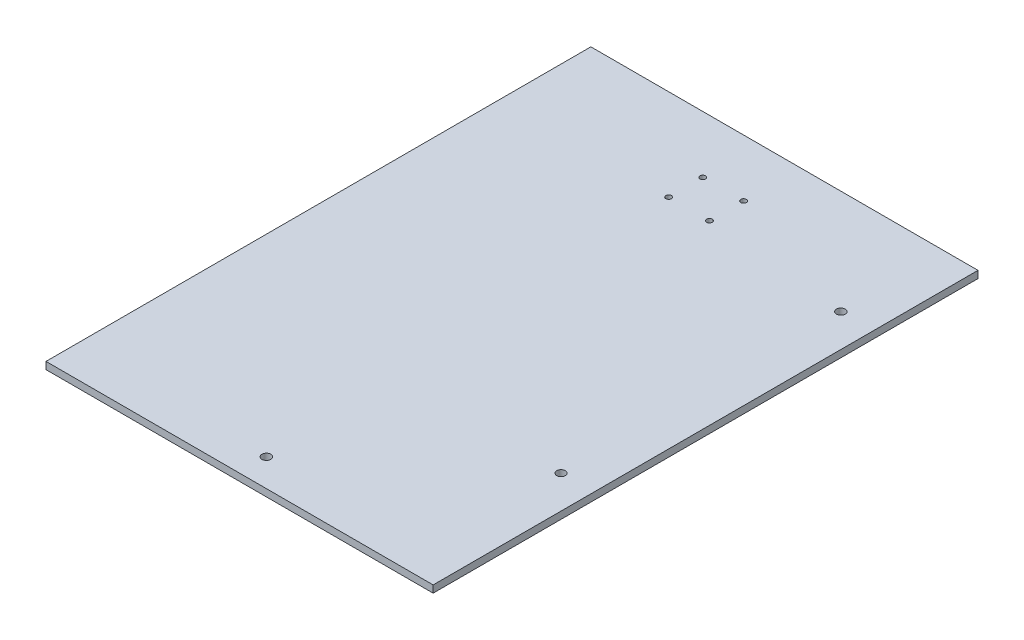
ISO-10303-21;
HEADER;
FILE_DESCRIPTION(('STEP AP214'),'2;1');
FILE_NAME('part.step','',(''),(''),'','','');
FILE_SCHEMA(('AUTOMOTIVE_DESIGN { 1 0 10303 214 1 1 1 1 }'));
ENDSEC;
DATA;
#1=APPLICATION_CONTEXT('core data for automotive mechanical design processes');
#2=APPLICATION_PROTOCOL_DEFINITION('international standard','automotive_design',2000,#1);
#3=PRODUCT_CONTEXT('',#1,'mechanical');
#4=PRODUCT('Part','Part','',(#3));
#5=PRODUCT_RELATED_PRODUCT_CATEGORY('part','',(#4));
#6=PRODUCT_DEFINITION_FORMATION('','',#4);
#7=PRODUCT_DEFINITION_CONTEXT('part definition',#1,'design');
#8=PRODUCT_DEFINITION('design','',#6,#7);
#9=PRODUCT_DEFINITION_SHAPE('','',#8);
#10=(LENGTH_UNIT() NAMED_UNIT(*) SI_UNIT(.MILLI.,.METRE.));
#11=(NAMED_UNIT(*) PLANE_ANGLE_UNIT() SI_UNIT($,.RADIAN.));
#12=(NAMED_UNIT(*) SI_UNIT($,.STERADIAN.) SOLID_ANGLE_UNIT());
#13=UNCERTAINTY_MEASURE_WITH_UNIT(LENGTH_MEASURE(1.E-05),#10,'distance_accuracy_value','');
#14=(GEOMETRIC_REPRESENTATION_CONTEXT(3) GLOBAL_UNCERTAINTY_ASSIGNED_CONTEXT((#13)) GLOBAL_UNIT_ASSIGNED_CONTEXT((#10,
#11,#12)) REPRESENTATION_CONTEXT('',''));
#15=CARTESIAN_POINT('',(0.,0.,0.));
#16=DIRECTION('',(0.,0.,1.));
#17=DIRECTION('',(1.,0.,0.));
#18=AXIS2_PLACEMENT_3D('',#15,#16,#17);
#19=CARTESIAN_POINT('',(5.00000000000006,44.9999999999995,380.));
#20=DIRECTION('',(1.,0.,0.));
#21=DIRECTION('',(0.,0.,-1.));
#22=AXIS2_PLACEMENT_3D('',#19,#20,#21);
#23=PLANE('',#22);
#24=DIRECTION('',(0.,-1.,0.));
#25=VECTOR('',#24,1.);
#26=CARTESIAN_POINT('',(5.00000000000006,44.9999999999995,0.));
#27=LINE('',#26,#25);
#28=CARTESIAN_POINT('',(5.00000000000006,49.9999999999995,0.));
#29=VERTEX_POINT('',#28);
#30=CARTESIAN_POINT('',(5.00000000000006,44.9999999999995,0.));
#31=VERTEX_POINT('',#30);
#32=EDGE_CURVE('E96',#29,#31,#27,.T.);
#33=ORIENTED_EDGE('',*,*,#32,.T.);
#34=DIRECTION('',(0.,0.,-1.));
#35=VECTOR('',#34,1.);
#36=CARTESIAN_POINT('',(5.00000000000006,44.9999999999995,380.));
#37=LINE('',#36,#35);
#38=CARTESIAN_POINT('',(5.00000000000006,44.9999999999995,380.));
#39=VERTEX_POINT('',#38);
#40=EDGE_CURVE('E11',#39,#31,#37,.T.);
#41=ORIENTED_EDGE('',*,*,#40,.F.);
#42=DIRECTION('',(0.,-1.,0.));
#43=VECTOR('',#42,1.);
#44=CARTESIAN_POINT('',(5.00000000000006,44.9999999999995,380.));
#45=LINE('',#44,#43);
#46=CARTESIAN_POINT('',(5.00000000000006,49.9999999999995,380.));
#47=VERTEX_POINT('',#46);
#48=EDGE_CURVE('E84',#47,#39,#45,.T.);
#49=ORIENTED_EDGE('',*,*,#48,.F.);
#50=DIRECTION('',(0.,0.,-1.));
#51=VECTOR('',#50,1.);
#52=CARTESIAN_POINT('',(5.00000000000006,49.9999999999995,380.));
#53=LINE('',#52,#51);
#54=EDGE_CURVE('E92',#47,#29,#53,.T.);
#55=ORIENTED_EDGE('',*,*,#54,.T.);
#56=EDGE_LOOP('',(#33,#41,#49,#55));
#57=FACE_BOUND('',#56,.T.);
#58=ADVANCED_FACE('F33',(#57),#23,.F.);
#59=CARTESIAN_POINT('',(5.00000000000006,44.9999999999995,380.));
#60=DIRECTION('',(0.,1.,0.));
#61=DIRECTION('',(0.,0.,1.));
#62=AXIS2_PLACEMENT_3D('',#59,#60,#61);
#63=PLANE('',#62);
#64=CARTESIAN_POINT('',(139.467321486498,44.9999999999995,360.775883092572));
#65=DIRECTION('',(0.,1.,0.));
#66=DIRECTION('',(0.,0.,1.));
#67=AXIS2_PLACEMENT_3D('',#64,#65,#66);
#68=CIRCLE('',#67,3.10619655518888);
#69=CARTESIAN_POINT('',(139.467321486498,44.9999999999995,363.882079647761));
#70=VERTEX_POINT('',#69);
#71=EDGE_CURVE('E140',#70,#70,#68,.F.);
#72=ORIENTED_EDGE('',*,*,#71,.F.);
#73=EDGE_LOOP('',(#72));
#74=FACE_BOUND('',#73,.T.);
#75=CARTESIAN_POINT('',(252.112318831267,44.9999999999995,72.7487860125337));
#76=DIRECTION('',(0.,1.,0.));
#77=DIRECTION('',(0.,0.,1.));
#78=AXIS2_PLACEMENT_3D('',#75,#76,#77);
#79=CIRCLE('',#78,3.08935834076927);
#80=CARTESIAN_POINT('',(252.112318831267,44.9999999999995,75.8381443533029));
#81=VERTEX_POINT('',#80);
#82=EDGE_CURVE('E139',#81,#81,#79,.F.);
#83=ORIENTED_EDGE('',*,*,#82,.F.);
#84=EDGE_LOOP('',(#83));
#85=FACE_BOUND('',#84,.T.);
#86=CARTESIAN_POINT('',(252.112318831273,44.9999999999995,267.889689572101));
#87=DIRECTION('',(0.,1.,0.));
#88=DIRECTION('',(0.,0.,1.));
#89=AXIS2_PLACEMENT_3D('',#86,#87,#88);
#90=CIRCLE('',#89,3.01854289737014);
#91=CARTESIAN_POINT('',(252.112318831273,44.9999999999995,270.908232469471));
#92=VERTEX_POINT('',#91);
#93=EDGE_CURVE('E133',#92,#92,#90,.F.);
#94=ORIENTED_EDGE('',*,*,#93,.F.);
#95=EDGE_LOOP('',(#94));
#96=FACE_BOUND('',#95,.T.);
#97=CARTESIAN_POINT('',(122.901099302246,44.9999999999995,63.6656702700523));
#98=DIRECTION('',(0.,-1.,0.));
#99=DIRECTION('',(0.,0.,-1.));
#100=AXIS2_PLACEMENT_3D('',#97,#98,#99);
#101=CIRCLE('',#100,1.93757474891772);
#102=CARTESIAN_POINT('',(122.901099302246,44.9999999999995,61.7280955211346));
#103=VERTEX_POINT('',#102);
#104=EDGE_CURVE('E119',#103,#103,#101,.T.);
#105=ORIENTED_EDGE('',*,*,#104,.F.);
#106=EDGE_LOOP('',(#105));
#107=FACE_BOUND('',#106,.T.);
#108=CARTESIAN_POINT('',(151.362300697758,44.9999999999995,39.8469513513073));
#109=DIRECTION('',(0.,-1.,0.));
#110=DIRECTION('',(0.,0.,-1.));
#111=AXIS2_PLACEMENT_3D('',#108,#109,#110);
#112=CIRCLE('',#111,1.93809227915303);
#113=CARTESIAN_POINT('',(151.362300697758,44.9999999999995,37.9088590721543));
#114=VERTEX_POINT('',#113);
#115=EDGE_CURVE('E120',#114,#114,#112,.T.);
#116=ORIENTED_EDGE('',*,*,#115,.F.);
#117=EDGE_LOOP('',(#116));
#118=FACE_BOUND('',#117,.T.);
#119=CARTESIAN_POINT('',(151.362300697758,44.9999999999995,63.6656702700522));
#120=DIRECTION('',(0.,-1.,0.));
#121=DIRECTION('',(0.,0.,-1.));
#122=AXIS2_PLACEMENT_3D('',#119,#120,#121);
#123=CIRCLE('',#122,1.96247659577143);
#124=CARTESIAN_POINT('',(151.362300697758,44.9999999999995,61.7031936742808));
#125=VERTEX_POINT('',#124);
#126=EDGE_CURVE('E130',#125,#125,#123,.T.);
#127=ORIENTED_EDGE('',*,*,#126,.F.);
#128=EDGE_LOOP('',(#127));
#129=FACE_BOUND('',#128,.T.);
#130=CARTESIAN_POINT('',(122.901099302246,44.9999999999995,39.8469513513074));
#131=DIRECTION('',(0.,-1.,0.));
#132=DIRECTION('',(0.,0.,-1.));
#133=AXIS2_PLACEMENT_3D('',#130,#131,#132);
#134=CIRCLE('',#133,1.9330546197071);
#135=CARTESIAN_POINT('',(122.901099302246,44.9999999999995,37.9138967316004));
#136=VERTEX_POINT('',#135);
#137=EDGE_CURVE('E112',#136,#136,#134,.T.);
#138=ORIENTED_EDGE('',*,*,#137,.F.);
#139=EDGE_LOOP('',(#138));
#140=FACE_BOUND('',#139,.T.);
#141=DIRECTION('',(1.,0.,0.));
#142=VECTOR('',#141,1.);
#143=CARTESIAN_POINT('',(5.00000000000006,44.9999999999995,0.));
#144=LINE('',#143,#142);
#145=CARTESIAN_POINT('',(275.,44.9999999999995,0.));
#146=VERTEX_POINT('',#145);
#147=EDGE_CURVE('E88',#31,#146,#144,.T.);
#148=ORIENTED_EDGE('',*,*,#147,.T.);
#149=DIRECTION('',(0.,0.,-1.));
#150=VECTOR('',#149,1.);
#151=CARTESIAN_POINT('',(275.,44.9999999999995,380.));
#152=LINE('',#151,#150);
#153=CARTESIAN_POINT('',(275.,44.9999999999995,380.));
#154=VERTEX_POINT('',#153);
#155=EDGE_CURVE('E41',#154,#146,#152,.T.);
#156=ORIENTED_EDGE('',*,*,#155,.F.);
#157=DIRECTION('',(1.,0.,0.));
#158=VECTOR('',#157,1.);
#159=CARTESIAN_POINT('',(5.00000000000006,44.9999999999995,380.));
#160=LINE('',#159,#158);
#161=EDGE_CURVE('E79',#39,#154,#160,.T.);
#162=ORIENTED_EDGE('',*,*,#161,.F.);
#163=ORIENTED_EDGE('',*,*,#40,.T.);
#164=EDGE_LOOP('',(#148,#156,#162,#163));
#165=FACE_BOUND('',#164,.T.);
#166=ADVANCED_FACE('F87',(#74,#85,#96,#107,#118,#129,#140,#165),#63,.F.);
#167=CARTESIAN_POINT('',(275.,44.9999999999995,380.));
#168=DIRECTION('',(-1.,0.,0.));
#169=DIRECTION('',(0.,0.,1.));
#170=AXIS2_PLACEMENT_3D('',#167,#168,#169);
#171=PLANE('',#170);
#172=DIRECTION('',(0.,1.,0.));
#173=VECTOR('',#172,1.);
#174=CARTESIAN_POINT('',(275.,44.9999999999995,0.));
#175=LINE('',#174,#173);
#176=CARTESIAN_POINT('',(275.,49.9999999999995,0.));
#177=VERTEX_POINT('',#176);
#178=EDGE_CURVE('E66',#146,#177,#175,.T.);
#179=ORIENTED_EDGE('',*,*,#178,.T.);
#180=DIRECTION('',(0.,0.,-1.));
#181=VECTOR('',#180,1.);
#182=CARTESIAN_POINT('',(275.,49.9999999999995,380.));
#183=LINE('',#182,#181);
#184=CARTESIAN_POINT('',(275.,49.9999999999995,380.));
#185=VERTEX_POINT('',#184);
#186=EDGE_CURVE('E89',#185,#177,#183,.T.);
#187=ORIENTED_EDGE('',*,*,#186,.F.);
#188=DIRECTION('',(0.,1.,0.));
#189=VECTOR('',#188,1.);
#190=CARTESIAN_POINT('',(275.,44.9999999999995,380.));
#191=LINE('',#190,#189);
#192=EDGE_CURVE('E82',#154,#185,#191,.T.);
#193=ORIENTED_EDGE('',*,*,#192,.F.);
#194=ORIENTED_EDGE('',*,*,#155,.T.);
#195=EDGE_LOOP('',(#179,#187,#193,#194));
#196=FACE_BOUND('',#195,.T.);
#197=ADVANCED_FACE('F90',(#196),#171,.F.);
#198=CARTESIAN_POINT('',(5.00000000000006,49.9999999999995,380.));
#199=DIRECTION('',(0.,-1.,0.));
#200=DIRECTION('',(1.,0.,0.));
#201=AXIS2_PLACEMENT_3D('',#198,#199,#200);
#202=PLANE('',#201);
#203=CARTESIAN_POINT('',(139.467321486498,49.9999999999995,360.775883092572));
#204=DIRECTION('',(0.,1.,0.));
#205=DIRECTION('',(-1.,0.,0.));
#206=AXIS2_PLACEMENT_3D('',#203,#204,#205);
#207=CIRCLE('',#206,3.10619655518888);
#208=CARTESIAN_POINT('',(136.361124931309,49.9999999999995,360.775883092572));
#209=VERTEX_POINT('',#208);
#210=EDGE_CURVE('E144',#209,#209,#207,.T.);
#211=ORIENTED_EDGE('',*,*,#210,.F.);
#212=EDGE_LOOP('',(#211));
#213=FACE_BOUND('',#212,.T.);
#214=CARTESIAN_POINT('',(252.112318831267,49.9999999999995,72.7487860125337));
#215=DIRECTION('',(0.,1.,0.));
#216=DIRECTION('',(-1.,0.,0.));
#217=AXIS2_PLACEMENT_3D('',#214,#215,#216);
#218=CIRCLE('',#217,3.08935834076927);
#219=CARTESIAN_POINT('',(249.022960490498,49.9999999999995,72.7487860125337));
#220=VERTEX_POINT('',#219);
#221=EDGE_CURVE('E143',#220,#220,#218,.T.);
#222=ORIENTED_EDGE('',*,*,#221,.F.);
#223=EDGE_LOOP('',(#222));
#224=FACE_BOUND('',#223,.T.);
#225=CARTESIAN_POINT('',(252.112318831273,49.9999999999995,267.889689572101));
#226=DIRECTION('',(0.,1.,0.));
#227=DIRECTION('',(-1.,0.,0.));
#228=AXIS2_PLACEMENT_3D('',#225,#226,#227);
#229=CIRCLE('',#228,3.01854289737014);
#230=CARTESIAN_POINT('',(249.093775933903,49.9999999999995,267.889689572101));
#231=VERTEX_POINT('',#230);
#232=EDGE_CURVE('E136',#231,#231,#229,.T.);
#233=ORIENTED_EDGE('',*,*,#232,.F.);
#234=EDGE_LOOP('',(#233));
#235=FACE_BOUND('',#234,.T.);
#236=CARTESIAN_POINT('',(122.901099302246,49.9999999999995,63.6656702700523));
#237=DIRECTION('',(0.,-1.,0.));
#238=DIRECTION('',(1.,0.,0.));
#239=AXIS2_PLACEMENT_3D('',#236,#237,#238);
#240=CIRCLE('',#239,1.93757474891772);
#241=CARTESIAN_POINT('',(124.838674051163,49.9999999999995,63.6656702700523));
#242=VERTEX_POINT('',#241);
#243=EDGE_CURVE('E115',#242,#242,#240,.F.);
#244=ORIENTED_EDGE('',*,*,#243,.F.);
#245=EDGE_LOOP('',(#244));
#246=FACE_BOUND('',#245,.T.);
#247=CARTESIAN_POINT('',(151.362300697758,49.9999999999995,39.8469513513073));
#248=DIRECTION('',(0.,-1.,0.));
#249=DIRECTION('',(1.,0.,0.));
#250=AXIS2_PLACEMENT_3D('',#247,#248,#249);
#251=CIRCLE('',#250,1.93809227915303);
#252=CARTESIAN_POINT('',(153.300392976911,49.9999999999995,39.8469513513073));
#253=VERTEX_POINT('',#252);
#254=EDGE_CURVE('E116',#253,#253,#251,.F.);
#255=ORIENTED_EDGE('',*,*,#254,.F.);
#256=EDGE_LOOP('',(#255));
#257=FACE_BOUND('',#256,.T.);
#258=CARTESIAN_POINT('',(151.362300697758,49.9999999999995,63.6656702700522));
#259=DIRECTION('',(0.,-1.,0.));
#260=DIRECTION('',(1.,0.,0.));
#261=AXIS2_PLACEMENT_3D('',#258,#259,#260);
#262=CIRCLE('',#261,1.96247659577143);
#263=CARTESIAN_POINT('',(153.324777293529,49.9999999999995,63.6656702700522));
#264=VERTEX_POINT('',#263);
#265=EDGE_CURVE('E123',#264,#264,#262,.F.);
#266=ORIENTED_EDGE('',*,*,#265,.F.);
#267=EDGE_LOOP('',(#266));
#268=FACE_BOUND('',#267,.T.);
#269=CARTESIAN_POINT('',(122.901099302246,49.9999999999995,39.8469513513074));
#270=DIRECTION('',(0.,-1.,0.));
#271=DIRECTION('',(1.,0.,0.));
#272=AXIS2_PLACEMENT_3D('',#269,#270,#271);
#273=CIRCLE('',#272,1.9330546197071);
#274=CARTESIAN_POINT('',(124.834153921953,49.9999999999995,39.8469513513074));
#275=VERTEX_POINT('',#274);
#276=EDGE_CURVE('E99',#275,#275,#273,.F.);
#277=ORIENTED_EDGE('',*,*,#276,.F.);
#278=EDGE_LOOP('',(#277));
#279=FACE_BOUND('',#278,.T.);
#280=DIRECTION('',(-1.,0.,0.));
#281=VECTOR('',#280,1.);
#282=CARTESIAN_POINT('',(5.00000000000006,49.9999999999995,0.));
#283=LINE('',#282,#281);
#284=EDGE_CURVE('E72',#177,#29,#283,.T.);
#285=ORIENTED_EDGE('',*,*,#284,.T.);
#286=ORIENTED_EDGE('',*,*,#54,.F.);
#287=DIRECTION('',(-1.,0.,0.));
#288=VECTOR('',#287,1.);
#289=CARTESIAN_POINT('',(5.00000000000006,49.9999999999995,380.));
#290=LINE('',#289,#288);
#291=EDGE_CURVE('E49',#185,#47,#290,.T.);
#292=ORIENTED_EDGE('',*,*,#291,.F.);
#293=ORIENTED_EDGE('',*,*,#186,.T.);
#294=EDGE_LOOP('',(#285,#286,#292,#293));
#295=FACE_BOUND('',#294,.T.);
#296=ADVANCED_FACE('F104',(#213,#224,#235,#246,#257,#268,#279,#295),#202,.F.);
#297=CARTESIAN_POINT('',(0.,0.,380.));
#298=DIRECTION('',(0.,0.,-1.));
#299=DIRECTION('',(-1.,0.,0.));
#300=AXIS2_PLACEMENT_3D('',#297,#298,#299);
#301=PLANE('',#300);
#302=ORIENTED_EDGE('',*,*,#48,.T.);
#303=ORIENTED_EDGE('',*,*,#161,.T.);
#304=ORIENTED_EDGE('',*,*,#192,.T.);
#305=ORIENTED_EDGE('',*,*,#291,.T.);
#306=EDGE_LOOP('',(#302,#303,#304,#305));
#307=FACE_BOUND('',#306,.T.);
#308=ADVANCED_FACE('F80',(#307),#301,.F.);
#309=CARTESIAN_POINT('',(0.,0.,0.));
#310=DIRECTION('',(0.,0.,-1.));
#311=DIRECTION('',(-1.,0.,0.));
#312=AXIS2_PLACEMENT_3D('',#309,#310,#311);
#313=PLANE('',#312);
#314=ORIENTED_EDGE('',*,*,#32,.F.);
#315=ORIENTED_EDGE('',*,*,#284,.F.);
#316=ORIENTED_EDGE('',*,*,#178,.F.);
#317=ORIENTED_EDGE('',*,*,#147,.F.);
#318=EDGE_LOOP('',(#314,#315,#316,#317));
#319=FACE_BOUND('',#318,.T.);
#320=ADVANCED_FACE('F107',(#319),#313,.T.);
#321=CARTESIAN_POINT('',(122.901099302246,50.0009999999995,39.8469513513074));
#322=DIRECTION('',(0.,-1.,0.));
#323=DIRECTION('',(0.,0.,-1.));
#324=AXIS2_PLACEMENT_3D('',#321,#322,#323);
#325=CYLINDRICAL_SURFACE('',#324,1.9330546197071);
#326=ORIENTED_EDGE('',*,*,#137,.T.);
#327=EDGE_LOOP('',(#326));
#328=FACE_BOUND('',#327,.T.);
#329=ORIENTED_EDGE('',*,*,#276,.T.);
#330=EDGE_LOOP('',(#329));
#331=FACE_BOUND('',#330,.T.);
#332=ADVANCED_FACE('F169',(#328,#331),#325,.F.);
#333=CARTESIAN_POINT('',(151.362300697758,50.0009999999995,63.6656702700522));
#334=DIRECTION('',(0.,-1.,0.));
#335=DIRECTION('',(0.,0.,-1.));
#336=AXIS2_PLACEMENT_3D('',#333,#334,#335);
#337=CYLINDRICAL_SURFACE('',#336,1.96247659577143);
#338=ORIENTED_EDGE('',*,*,#126,.T.);
#339=EDGE_LOOP('',(#338));
#340=FACE_BOUND('',#339,.T.);
#341=ORIENTED_EDGE('',*,*,#265,.T.);
#342=EDGE_LOOP('',(#341));
#343=FACE_BOUND('',#342,.T.);
#344=ADVANCED_FACE('F171',(#340,#343),#337,.F.);
#345=CARTESIAN_POINT('',(151.362300697758,50.0009999999995,39.8469513513073));
#346=DIRECTION('',(0.,-1.,0.));
#347=DIRECTION('',(0.,0.,-1.));
#348=AXIS2_PLACEMENT_3D('',#345,#346,#347);
#349=CYLINDRICAL_SURFACE('',#348,1.93809227915303);
#350=ORIENTED_EDGE('',*,*,#115,.T.);
#351=EDGE_LOOP('',(#350));
#352=FACE_BOUND('',#351,.T.);
#353=ORIENTED_EDGE('',*,*,#254,.T.);
#354=EDGE_LOOP('',(#353));
#355=FACE_BOUND('',#354,.T.);
#356=ADVANCED_FACE('F178',(#352,#355),#349,.F.);
#357=CARTESIAN_POINT('',(122.901099302246,50.0009999999995,63.6656702700523));
#358=DIRECTION('',(0.,-1.,0.));
#359=DIRECTION('',(0.,0.,-1.));
#360=AXIS2_PLACEMENT_3D('',#357,#358,#359);
#361=CYLINDRICAL_SURFACE('',#360,1.93757474891772);
#362=ORIENTED_EDGE('',*,*,#104,.T.);
#363=EDGE_LOOP('',(#362));
#364=FACE_BOUND('',#363,.T.);
#365=ORIENTED_EDGE('',*,*,#243,.T.);
#366=EDGE_LOOP('',(#365));
#367=FACE_BOUND('',#366,.T.);
#368=ADVANCED_FACE('F225',(#364,#367),#361,.F.);
#369=CARTESIAN_POINT('',(252.112318831273,44.9989999999995,267.889689572101));
#370=DIRECTION('',(0.,1.,0.));
#371=DIRECTION('',(-1.,0.,0.));
#372=AXIS2_PLACEMENT_3D('',#369,#370,#371);
#373=CYLINDRICAL_SURFACE('',#372,3.01854289737014);
#374=ORIENTED_EDGE('',*,*,#232,.T.);
#375=EDGE_LOOP('',(#374));
#376=FACE_BOUND('',#375,.T.);
#377=ORIENTED_EDGE('',*,*,#93,.T.);
#378=EDGE_LOOP('',(#377));
#379=FACE_BOUND('',#378,.T.);
#380=ADVANCED_FACE('F233',(#376,#379),#373,.F.);
#381=CARTESIAN_POINT('',(252.112318831267,44.9989999999995,72.7487860125337));
#382=DIRECTION('',(0.,1.,0.));
#383=DIRECTION('',(-1.,0.,0.));
#384=AXIS2_PLACEMENT_3D('',#381,#382,#383);
#385=CYLINDRICAL_SURFACE('',#384,3.08935834076927);
#386=ORIENTED_EDGE('',*,*,#221,.T.);
#387=EDGE_LOOP('',(#386));
#388=FACE_BOUND('',#387,.T.);
#389=ORIENTED_EDGE('',*,*,#82,.T.);
#390=EDGE_LOOP('',(#389));
#391=FACE_BOUND('',#390,.T.);
#392=ADVANCED_FACE('F152',(#388,#391),#385,.F.);
#393=CARTESIAN_POINT('',(139.467321486498,44.9989999999995,360.775883092572));
#394=DIRECTION('',(0.,1.,0.));
#395=DIRECTION('',(-1.,0.,0.));
#396=AXIS2_PLACEMENT_3D('',#393,#394,#395);
#397=CYLINDRICAL_SURFACE('',#396,3.10619655518888);
#398=ORIENTED_EDGE('',*,*,#210,.T.);
#399=EDGE_LOOP('',(#398));
#400=FACE_BOUND('',#399,.T.);
#401=ORIENTED_EDGE('',*,*,#71,.T.);
#402=EDGE_LOOP('',(#401));
#403=FACE_BOUND('',#402,.T.);
#404=ADVANCED_FACE('F250',(#400,#403),#397,.F.);
#405=CLOSED_SHELL('',(#58,#166,#197,#296,#308,#320,#332,#344,#356,#368,#380,#392,#404));
#406=MANIFOLD_SOLID_BREP('B2',#405);
#407=ADVANCED_BREP_SHAPE_REPRESENTATION('',(#18,#406),#14);
#408=SHAPE_DEFINITION_REPRESENTATION(#9,#407);
ENDSEC;
END-ISO-10303-21;
